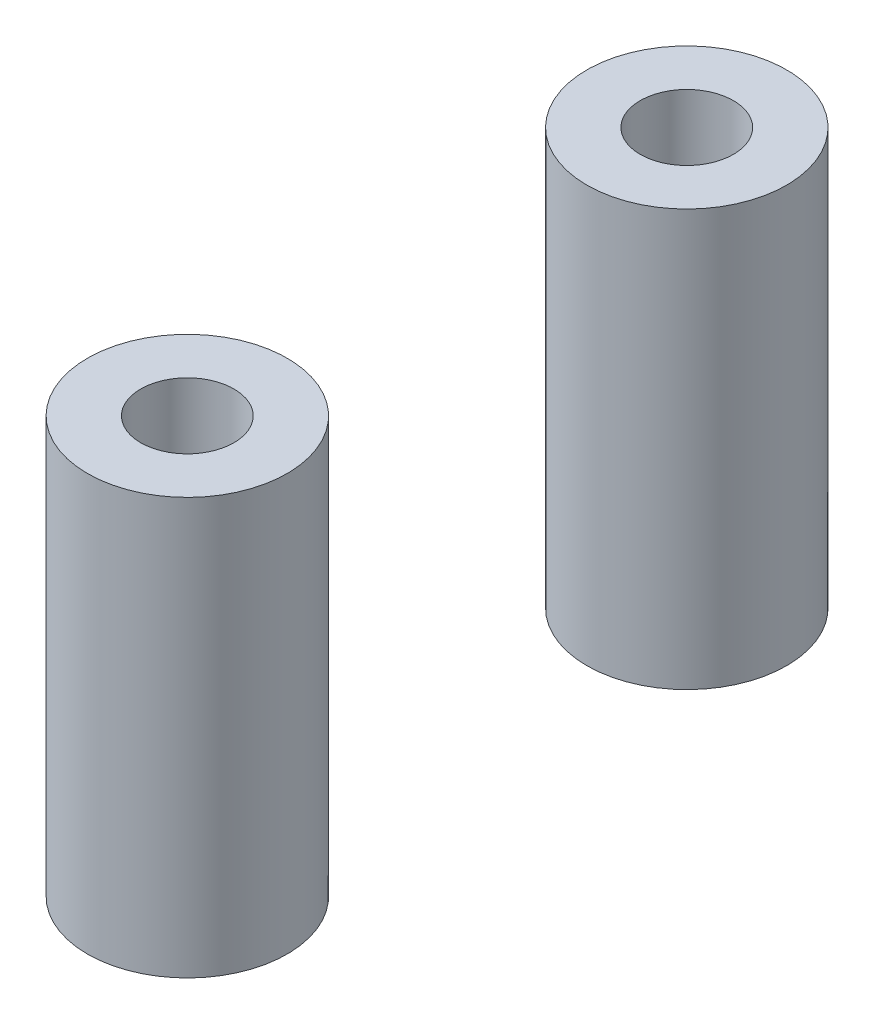
ISO-10303-21;
HEADER;
FILE_DESCRIPTION(('STEP AP214'),'2;1');
FILE_NAME('part.step','',(''),(''),'','','');
FILE_SCHEMA(('AUTOMOTIVE_DESIGN { 1 0 10303 214 1 1 1 1 }'));
ENDSEC;
DATA;
#1=APPLICATION_CONTEXT('core data for automotive mechanical design processes');
#2=APPLICATION_PROTOCOL_DEFINITION('international standard','automotive_design',2000,#1);
#3=PRODUCT_CONTEXT('',#1,'mechanical');
#4=PRODUCT('Part','Part','',(#3));
#5=PRODUCT_RELATED_PRODUCT_CATEGORY('part','',(#4));
#6=PRODUCT_DEFINITION_FORMATION('','',#4);
#7=PRODUCT_DEFINITION_CONTEXT('part definition',#1,'design');
#8=PRODUCT_DEFINITION('design','',#6,#7);
#9=PRODUCT_DEFINITION_SHAPE('','',#8);
#10=(LENGTH_UNIT() NAMED_UNIT(*) SI_UNIT(.MILLI.,.METRE.));
#11=(NAMED_UNIT(*) PLANE_ANGLE_UNIT() SI_UNIT($,.RADIAN.));
#12=(NAMED_UNIT(*) SI_UNIT($,.STERADIAN.) SOLID_ANGLE_UNIT());
#13=UNCERTAINTY_MEASURE_WITH_UNIT(LENGTH_MEASURE(1.E-05),#10,'distance_accuracy_value','');
#14=(GEOMETRIC_REPRESENTATION_CONTEXT(3) GLOBAL_UNCERTAINTY_ASSIGNED_CONTEXT((#13)) GLOBAL_UNIT_ASSIGNED_CONTEXT((#10,
#11,#12)) REPRESENTATION_CONTEXT('',''));
#15=CARTESIAN_POINT('',(0.,0.,0.));
#16=DIRECTION('',(0.,0.,1.));
#17=DIRECTION('',(1.,0.,0.));
#18=AXIS2_PLACEMENT_3D('',#15,#16,#17);
#19=CARTESIAN_POINT('',(5.19243181749132,12.5,-4.61899649593049));
#20=DIRECTION('',(0.,-1.,0.));
#21=DIRECTION('',(0.,0.,-1.));
#22=AXIS2_PLACEMENT_3D('',#19,#20,#21);
#23=CYLINDRICAL_SURFACE('',#22,3.);
#24=CARTESIAN_POINT('',(5.19243181749132,12.5,-4.61899649593049));
#25=DIRECTION('',(0.,1.,0.));
#26=DIRECTION('',(0.,0.,1.));
#27=AXIS2_PLACEMENT_3D('',#24,#25,#26);
#28=CIRCLE('',#27,3.);
#29=CARTESIAN_POINT('',(5.19243181749132,12.5,-1.61899649593049));
#30=VERTEX_POINT('',#29);
#31=EDGE_CURVE('E11',#30,#30,#28,.T.);
#32=ORIENTED_EDGE('',*,*,#31,.F.);
#33=EDGE_LOOP('',(#32));
#34=FACE_BOUND('',#33,.T.);
#35=CARTESIAN_POINT('',(5.19243181749132,0.,-4.61899649593049));
#36=DIRECTION('',(0.,1.,0.));
#37=DIRECTION('',(0.,0.,1.));
#38=AXIS2_PLACEMENT_3D('',#35,#36,#37);
#39=CIRCLE('',#38,3.);
#40=CARTESIAN_POINT('',(5.19243181749132,0.,-1.61899649593049));
#41=VERTEX_POINT('',#40);
#42=EDGE_CURVE('E50',#41,#41,#39,.T.);
#43=ORIENTED_EDGE('',*,*,#42,.T.);
#44=EDGE_LOOP('',(#43));
#45=FACE_BOUND('',#44,.T.);
#46=ADVANCED_FACE('F47',(#34,#45),#23,.T.);
#47=CARTESIAN_POINT('',(0.,12.5,0.));
#48=DIRECTION('',(0.,1.,0.));
#49=DIRECTION('',(0.,0.,1.));
#50=AXIS2_PLACEMENT_3D('',#47,#48,#49);
#51=PLANE('',#50);
#52=CARTESIAN_POINT('',(5.19243181749132,12.5,-4.61899649593049));
#53=DIRECTION('',(0.,1.,0.));
#54=DIRECTION('',(0.,0.,1.));
#55=AXIS2_PLACEMENT_3D('',#52,#53,#54);
#56=CIRCLE('',#55,1.4);
#57=CARTESIAN_POINT('',(5.19243181749132,12.5,-3.21899649593049));
#58=VERTEX_POINT('',#57);
#59=EDGE_CURVE('E59',#58,#58,#56,.T.);
#60=ORIENTED_EDGE('',*,*,#59,.F.);
#61=EDGE_LOOP('',(#60));
#62=FACE_BOUND('',#61,.T.);
#63=ORIENTED_EDGE('',*,*,#31,.T.);
#64=EDGE_LOOP('',(#63));
#65=FACE_BOUND('',#64,.T.);
#66=ADVANCED_FACE('F74',(#62,#65),#51,.T.);
#67=CARTESIAN_POINT('',(0.,0.,0.));
#68=DIRECTION('',(0.,1.,0.));
#69=DIRECTION('',(0.,0.,1.));
#70=AXIS2_PLACEMENT_3D('',#67,#68,#69);
#71=PLANE('',#70);
#72=ORIENTED_EDGE('',*,*,#42,.F.);
#73=EDGE_LOOP('',(#72));
#74=FACE_BOUND('',#73,.T.);
#75=ADVANCED_FACE('F70',(#74),#71,.F.);
#76=CARTESIAN_POINT('',(5.19243181749132,2.5,-4.61899649593049));
#77=DIRECTION('',(0.,1.,0.));
#78=DIRECTION('',(0.,0.,1.));
#79=AXIS2_PLACEMENT_3D('',#76,#77,#78);
#80=CYLINDRICAL_SURFACE('',#79,1.4);
#81=CARTESIAN_POINT('',(5.19243181749132,2.5,-4.61899649593049));
#82=DIRECTION('',(0.,1.,0.));
#83=DIRECTION('',(0.,0.,1.));
#84=AXIS2_PLACEMENT_3D('',#81,#82,#83);
#85=CIRCLE('',#84,1.4);
#86=CARTESIAN_POINT('',(5.19243181749132,2.5,-3.21899649593049));
#87=VERTEX_POINT('',#86);
#88=EDGE_CURVE('E57',#87,#87,#85,.T.);
#89=ORIENTED_EDGE('',*,*,#88,.F.);
#90=EDGE_LOOP('',(#89));
#91=FACE_BOUND('',#90,.T.);
#92=ORIENTED_EDGE('',*,*,#59,.T.);
#93=EDGE_LOOP('',(#92));
#94=FACE_BOUND('',#93,.T.);
#95=ADVANCED_FACE('F67',(#91,#94),#80,.F.);
#96=CARTESIAN_POINT('',(5.19243181749132,2.5,-4.61899649593049));
#97=DIRECTION('',(0.,1.,0.));
#98=DIRECTION('',(0.,0.,1.));
#99=AXIS2_PLACEMENT_3D('',#96,#97,#98);
#100=PLANE('',#99);
#101=ORIENTED_EDGE('',*,*,#88,.T.);
#102=EDGE_LOOP('',(#101));
#103=FACE_BOUND('',#102,.T.);
#104=ADVANCED_FACE('F65',(#103),#100,.T.);
#105=CLOSED_SHELL('',(#46,#66,#75,#95,#104));
#106=MANIFOLD_SOLID_BREP('B2',#105);
#107=CARTESIAN_POINT('',(5.19243181749132,12.5,10.3810035040695));
#108=DIRECTION('',(0.,-1.,0.));
#109=DIRECTION('',(0.,0.,-1.));
#110=AXIS2_PLACEMENT_3D('',#107,#108,#109);
#111=CYLINDRICAL_SURFACE('',#110,3.);
#112=CARTESIAN_POINT('',(5.19243181749132,12.5,10.3810035040695));
#113=DIRECTION('',(0.,1.,0.));
#114=DIRECTION('',(0.,0.,1.));
#115=AXIS2_PLACEMENT_3D('',#112,#113,#114);
#116=CIRCLE('',#115,3.);
#117=CARTESIAN_POINT('',(5.19243181749132,12.5,13.3810035040695));
#118=VERTEX_POINT('',#117);
#119=EDGE_CURVE('E46',#118,#118,#116,.T.);
#120=ORIENTED_EDGE('',*,*,#119,.F.);
#121=EDGE_LOOP('',(#120));
#122=FACE_BOUND('',#121,.T.);
#123=CARTESIAN_POINT('',(5.19243181749132,0.,10.3810035040695));
#124=DIRECTION('',(0.,1.,0.));
#125=DIRECTION('',(0.,0.,1.));
#126=AXIS2_PLACEMENT_3D('',#123,#124,#125);
#127=CIRCLE('',#126,3.);
#128=CARTESIAN_POINT('',(5.19243181749132,0.,13.3810035040695));
#129=VERTEX_POINT('',#128);
#130=EDGE_CURVE('E121',#129,#129,#127,.T.);
#131=ORIENTED_EDGE('',*,*,#130,.T.);
#132=EDGE_LOOP('',(#131));
#133=FACE_BOUND('',#132,.T.);
#134=ADVANCED_FACE('F118',(#122,#133),#111,.T.);
#135=CARTESIAN_POINT('',(0.,12.5,0.));
#136=DIRECTION('',(0.,1.,0.));
#137=DIRECTION('',(0.,0.,1.));
#138=AXIS2_PLACEMENT_3D('',#135,#136,#137);
#139=PLANE('',#138);
#140=CARTESIAN_POINT('',(5.19243181749132,12.5,10.3810035040695));
#141=DIRECTION('',(0.,1.,0.));
#142=DIRECTION('',(0.,0.,1.));
#143=AXIS2_PLACEMENT_3D('',#140,#141,#142);
#144=CIRCLE('',#143,1.4);
#145=CARTESIAN_POINT('',(5.19243181749132,12.5,11.7810035040695));
#146=VERTEX_POINT('',#145);
#147=EDGE_CURVE('E128',#146,#146,#144,.T.);
#148=ORIENTED_EDGE('',*,*,#147,.F.);
#149=EDGE_LOOP('',(#148));
#150=FACE_BOUND('',#149,.T.);
#151=ORIENTED_EDGE('',*,*,#119,.T.);
#152=EDGE_LOOP('',(#151));
#153=FACE_BOUND('',#152,.T.);
#154=ADVANCED_FACE('F138',(#150,#153),#139,.T.);
#155=CARTESIAN_POINT('',(0.,0.,0.));
#156=DIRECTION('',(0.,1.,0.));
#157=DIRECTION('',(0.,0.,1.));
#158=AXIS2_PLACEMENT_3D('',#155,#156,#157);
#159=PLANE('',#158);
#160=ORIENTED_EDGE('',*,*,#130,.F.);
#161=EDGE_LOOP('',(#160));
#162=FACE_BOUND('',#161,.T.);
#163=ADVANCED_FACE('F140',(#162),#159,.F.);
#164=CARTESIAN_POINT('',(5.19243181749132,2.5,10.3810035040695));
#165=DIRECTION('',(0.,1.,0.));
#166=DIRECTION('',(0.,0.,1.));
#167=AXIS2_PLACEMENT_3D('',#164,#165,#166);
#168=CYLINDRICAL_SURFACE('',#167,1.4);
#169=CARTESIAN_POINT('',(5.19243181749132,2.5,10.3810035040695));
#170=DIRECTION('',(0.,1.,0.));
#171=DIRECTION('',(0.,0.,1.));
#172=AXIS2_PLACEMENT_3D('',#169,#170,#171);
#173=CIRCLE('',#172,1.4);
#174=CARTESIAN_POINT('',(5.19243181749132,2.5,11.7810035040695));
#175=VERTEX_POINT('',#174);
#176=EDGE_CURVE('E130',#175,#175,#173,.T.);
#177=ORIENTED_EDGE('',*,*,#176,.F.);
#178=EDGE_LOOP('',(#177));
#179=FACE_BOUND('',#178,.T.);
#180=ORIENTED_EDGE('',*,*,#147,.T.);
#181=EDGE_LOOP('',(#180));
#182=FACE_BOUND('',#181,.T.);
#183=ADVANCED_FACE('F136',(#179,#182),#168,.F.);
#184=CARTESIAN_POINT('',(5.19243181749132,2.5,10.3810035040695));
#185=DIRECTION('',(0.,1.,0.));
#186=DIRECTION('',(0.,0.,1.));
#187=AXIS2_PLACEMENT_3D('',#184,#185,#186);
#188=PLANE('',#187);
#189=ORIENTED_EDGE('',*,*,#176,.T.);
#190=EDGE_LOOP('',(#189));
#191=FACE_BOUND('',#190,.T.);
#192=ADVANCED_FACE('F150',(#191),#188,.T.);
#193=CLOSED_SHELL('',(#134,#154,#163,#183,#192));
#194=MANIFOLD_SOLID_BREP('B6',#193);
#195=ADVANCED_BREP_SHAPE_REPRESENTATION('',(#18,#106,#194),#14);
#196=SHAPE_DEFINITION_REPRESENTATION(#9,#195);
ENDSEC;
END-ISO-10303-21;
